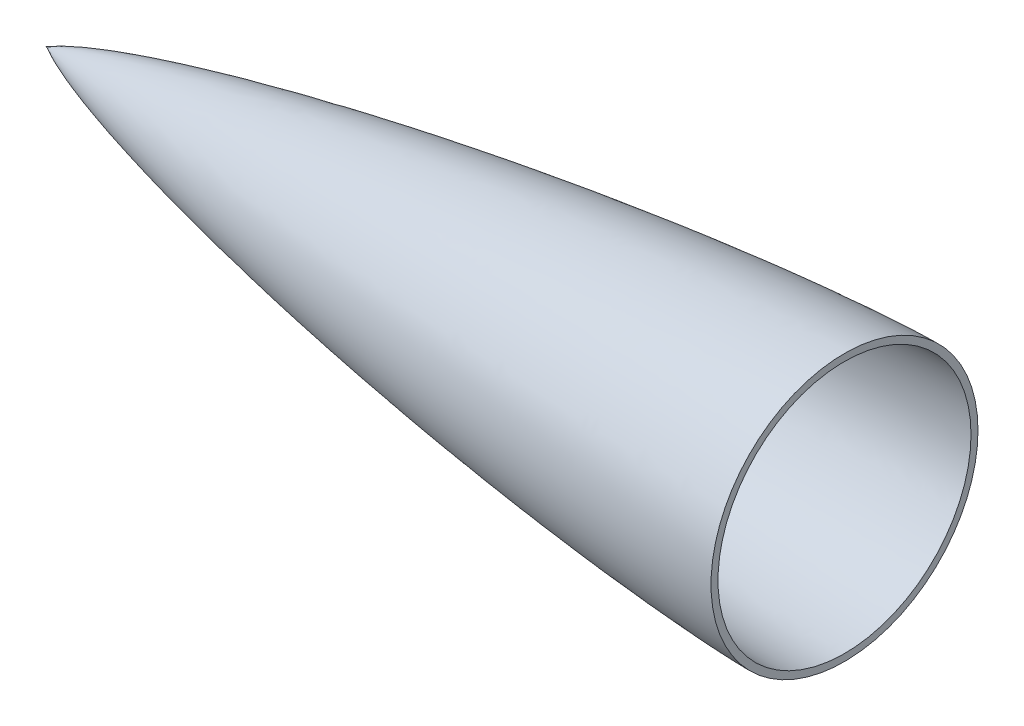
ISO-10303-21;
HEADER;
FILE_DESCRIPTION(('STEP AP214'),'2;1');
FILE_NAME('part.step','',(''),(''),'','','');
FILE_SCHEMA(('AUTOMOTIVE_DESIGN { 1 0 10303 214 1 1 1 1 }'));
ENDSEC;
DATA;
#1=APPLICATION_CONTEXT('core data for automotive mechanical design processes');
#2=APPLICATION_PROTOCOL_DEFINITION('international standard','automotive_design',2000,#1);
#3=PRODUCT_CONTEXT('',#1,'mechanical');
#4=PRODUCT('Part','Part','',(#3));
#5=PRODUCT_RELATED_PRODUCT_CATEGORY('part','',(#4));
#6=PRODUCT_DEFINITION_FORMATION('','',#4);
#7=PRODUCT_DEFINITION_CONTEXT('part definition',#1,'design');
#8=PRODUCT_DEFINITION('design','',#6,#7);
#9=PRODUCT_DEFINITION_SHAPE('','',#8);
#10=(LENGTH_UNIT() NAMED_UNIT(*) SI_UNIT(.MILLI.,.METRE.));
#11=(NAMED_UNIT(*) PLANE_ANGLE_UNIT() SI_UNIT($,.RADIAN.));
#12=(NAMED_UNIT(*) SI_UNIT($,.STERADIAN.) SOLID_ANGLE_UNIT());
#13=UNCERTAINTY_MEASURE_WITH_UNIT(LENGTH_MEASURE(1.E-05),#10,'distance_accuracy_value','');
#14=(GEOMETRIC_REPRESENTATION_CONTEXT(3) GLOBAL_UNCERTAINTY_ASSIGNED_CONTEXT((#13)) GLOBAL_UNIT_ASSIGNED_CONTEXT((#10,
#11,#12)) REPRESENTATION_CONTEXT('',''));
#15=CARTESIAN_POINT('',(0.,0.,0.));
#16=DIRECTION('',(0.,0.,1.));
#17=DIRECTION('',(1.,0.,0.));
#18=AXIS2_PLACEMENT_3D('',#15,#16,#17);
#19=CARTESIAN_POINT('',(200.,0.,-33.4355685150698));
#20=CARTESIAN_POINT('',(199.322179654003,0.,-33.4323383643763));
#21=CARTESIAN_POINT('',(197.96668201448,0.,-33.4109822420062));
#22=CARTESIAN_POINT('',(193.575946740602,0.,-33.2950534490437));
#23=CARTESIAN_POINT('',(186.154623569186,0.,-32.9539645763986));
#24=CARTESIAN_POINT('',(176.386553472775,0.,-32.3323949245245));
#25=CARTESIAN_POINT('',(164.280072944056,0.,-31.3478971261456));
#26=CARTESIAN_POINT('',(152.189147407201,0.,-30.1899129927248));
#27=CARTESIAN_POINT('',(140.114018126728,0.,-28.8775873685312));
#28=CARTESIAN_POINT('',(128.05522623978,0.,-27.4232989862083));
#29=CARTESIAN_POINT('',(116.013631476871,0.,-25.8328412652977));
#30=CARTESIAN_POINT('',(103.990482125065,0.,-24.1085760118513));
#31=CARTESIAN_POINT('',(91.9875106556967,0.,-22.248884905431));
#32=CARTESIAN_POINT('',(80.0071383039936,0.,-20.2486418789882));
#33=CARTESIAN_POINT('',(68.052752748457,0.,-18.0981923642982));
#34=CARTESIAN_POINT('',(56.1293217805533,0.,-15.7818096250316));
#35=CARTESIAN_POINT('',(44.2443671822434,0.,-13.2745922542246));
#36=CARTESIAN_POINT('',(33.2254451342742,0.,-10.7238520935605));
#37=CARTESIAN_POINT('',(23.7399008996518,0.,-8.29191144076045));
#38=CARTESIAN_POINT('',(16.1615279538934,0.,-6.12216645315078));
#39=CARTESIAN_POINT('',(10.7984161562651,0.,-4.41093759935858));
#40=CARTESIAN_POINT('',(7.06503905609062,0.,-3.08569859262728));
#41=CARTESIAN_POINT('',(4.42378862410607,0.,-2.04005703667645));
#42=CARTESIAN_POINT('',(2.70977796726177,0.,-1.28363377804088));
#43=CARTESIAN_POINT('',(1.58549241696781,0.,-0.737587827803518));
#44=CARTESIAN_POINT('',(0.90429535730028,0.,-0.386360833356651));
#45=CARTESIAN_POINT('',(0.549478166428491,0.,-0.203997996855062));
#46=CARTESIAN_POINT('',(0.304588775814575,0.,-0.0914897913141497));
#47=CARTESIAN_POINT('',(0.175151488046642,0.,-0.0408399449586508));
#48=CARTESIAN_POINT('',(0.0889645538634368,0.,-0.0127715996474495));
#49=CARTESIAN_POINT('',(0.0297309525910866,0.,-0.00266548567570939));
#50=CARTESIAN_POINT('',(0.,0.,0.));
#51=B_SPLINE_CURVE_WITH_KNOTS('',4,(#19,#20,#21,#22,#23,#24,#25,#26,#27,#28,#29,#30,#31,#32,#33,
#34,#35,#36,#37,#38,#39,#40,#41,#42,#43,#44,#45,#46,#47,#48,#49,#50),.UNSPECIFIED.,.F.,.F.,(5,1,
1,1,1,1,1,1,1,1,1,1,1,1,1,1,1,1,1,1,1,1,1,1,1,1,1,1,5),(0.,0.0133209642117482,
0.0266419284234964,0.0863167691697009,0.145991610068889,0.205666451663834,0.265341292558525,
0.325016131418618,0.384690973552768,0.444365812322199,0.50404065606741,0.563715493321218,
0.623390332433378,0.683065171883309,0.742740011906119,0.802414855634365,0.862089687624013,
0.905325029529881,0.935162430760937,0.957312634774657,0.972707485547451,0.983165991718057,
0.990977432175115,0.994122067130278,0.997266702085442,0.998227464598054,0.998817984622571,
0.999415053510214,1.),.UNSPECIFIED.);
#52=CARTESIAN_POINT('',(200.,0.,0.));
#53=DIRECTION('',(1.,0.,0.));
#54=AXIS1_PLACEMENT('',#52,#53);
#55=SURFACE_OF_REVOLUTION('',#51,#54);
#56=CARTESIAN_POINT('',(0.,0.,0.));
#57=VERTEX_POINT('',#56);
#58=VERTEX_LOOP('',#57);
#59=FACE_BOUND('',#58,.T.);
#60=CARTESIAN_POINT('',(200.,0.,0.));
#61=DIRECTION('',(1.,0.,0.));
#62=DIRECTION('',(0.,0.,-1.));
#63=AXIS2_PLACEMENT_3D('',#60,#61,#62);
#64=CIRCLE('',#63,33.4355685150698);
#65=CARTESIAN_POINT('',(200.,0.,-33.4355685150698));
#66=VERTEX_POINT('',#65);
#67=EDGE_CURVE('E11',#66,#66,#64,.T.);
#68=ORIENTED_EDGE('',*,*,#67,.F.);
#69=EDGE_LOOP('',(#68));
#70=FACE_BOUND('',#69,.T.);
#71=ADVANCED_FACE('F32',(#59,#70),#55,.F.);
#72=CARTESIAN_POINT('',(200.,0.,-33.4355685150698));
#73=DIRECTION('',(1.,0.,0.));
#74=DIRECTION('',(0.,0.,-1.));
#75=AXIS2_PLACEMENT_3D('',#72,#73,#74);
#76=PLANE('',#75);
#77=CARTESIAN_POINT('',(200.,0.,0.));
#78=DIRECTION('',(1.,0.,0.));
#79=DIRECTION('',(0.,0.,-1.));
#80=AXIS2_PLACEMENT_3D('',#77,#78,#79);
#81=CIRCLE('',#80,31.6855482124485);
#82=CARTESIAN_POINT('',(200.,0.,-31.6855482124485));
#83=VERTEX_POINT('',#82);
#84=EDGE_CURVE('E39',#83,#83,#81,.T.);
#85=ORIENTED_EDGE('',*,*,#84,.F.);
#86=EDGE_LOOP('',(#85));
#87=FACE_BOUND('',#86,.T.);
#88=ORIENTED_EDGE('',*,*,#67,.T.);
#89=EDGE_LOOP('',(#88));
#90=FACE_BOUND('',#89,.T.);
#91=ADVANCED_FACE('F48',(#87,#90),#76,.T.);
#92=CARTESIAN_POINT('',(200.,0.,-33.4355685150698));
#93=CARTESIAN_POINT('',(199.322179654003,0.,-33.4323383643763));
#94=CARTESIAN_POINT('',(197.96668201448,0.,-33.4109822420062));
#95=CARTESIAN_POINT('',(193.575946740602,0.,-33.2950534490437));
#96=CARTESIAN_POINT('',(186.154623569186,0.,-32.9539645763986));
#97=CARTESIAN_POINT('',(176.386553472775,0.,-32.3323949245245));
#98=CARTESIAN_POINT('',(164.280072944056,0.,-31.3478971261456));
#99=CARTESIAN_POINT('',(152.189147407201,0.,-30.1899129927248));
#100=CARTESIAN_POINT('',(140.114018126728,0.,-28.8775873685312));
#101=CARTESIAN_POINT('',(128.05522623978,0.,-27.4232989862083));
#102=CARTESIAN_POINT('',(116.013631476871,0.,-25.8328412652977));
#103=CARTESIAN_POINT('',(103.990482125065,0.,-24.1085760118513));
#104=CARTESIAN_POINT('',(91.9875106556967,0.,-22.248884905431));
#105=CARTESIAN_POINT('',(80.0071383039936,0.,-20.2486418789882));
#106=CARTESIAN_POINT('',(68.052752748457,0.,-18.0981923642982));
#107=CARTESIAN_POINT('',(56.1293217805533,0.,-15.7818096250316));
#108=CARTESIAN_POINT('',(44.2443671822434,0.,-13.2745922542246));
#109=CARTESIAN_POINT('',(33.2254451342742,0.,-10.7238520935605));
#110=CARTESIAN_POINT('',(23.7399008996518,0.,-8.29191144076045));
#111=CARTESIAN_POINT('',(16.1615279538934,0.,-6.12216645315078));
#112=CARTESIAN_POINT('',(10.7984161562651,0.,-4.41093759935858));
#113=CARTESIAN_POINT('',(7.15446609725211,0.,-3.11744256062833));
#114=CARTESIAN_POINT('',(4.96995131345689,0.,-2.25613461671395));
#115=CARTESIAN_POINT('',(3.84672985171564,0.,-1.7780436069638));
#116=CARTESIAN_POINT('',(3.44639537802266,0.,-1.60209691594584));
#117=B_SPLINE_CURVE_WITH_KNOTS('',4,(#92,#93,#94,#95,#96,#97,#98,#99,#100,#101,#102,#103,#104,
#105,#106,#107,#108,#109,#110,#111,#112,#113,#114,#115,#116),.UNSPECIFIED.,.F.,.F.,(5,1,1,1,1,1,
1,1,1,1,1,1,1,1,1,1,1,1,1,1,1,5),(0.,0.0133209642117482,0.0266419284234964,0.0863167691697009,
0.145991610068889,0.205666451663834,0.265341292558525,0.325016131418618,0.384690973552768,
0.444365812322199,0.50404065606741,0.563715493321218,0.623390332433378,0.683065171883309,
0.742740011906119,0.802414855634365,0.862089687624013,0.905325029529881,0.935162430760937,
0.957312634774657,0.972707485547451,0.981301436720565),.UNSPECIFIED.);
#118=CARTESIAN_POINT('',(200.,0.,0.));
#119=DIRECTION('',(1.,0.,0.));
#120=AXIS1_PLACEMENT('',#118,#119);
#121=SURFACE_OF_REVOLUTION('',#117,#120);
#122=OFFSET_SURFACE('',#121,1.75,.F.);
#123=CARTESIAN_POINT('',(4.15051573131235,0.,0.));
#124=VERTEX_POINT('',#123);
#125=VERTEX_LOOP('',#124);
#126=FACE_BOUND('',#125,.T.);
#127=ORIENTED_EDGE('',*,*,#84,.T.);
#128=EDGE_LOOP('',(#127));
#129=FACE_BOUND('',#128,.T.);
#130=ADVANCED_FACE('F45',(#126,#129),#122,.T.);
#131=CLOSED_SHELL('',(#71,#91,#130));
#132=MANIFOLD_SOLID_BREP('B2',#131);
#133=ADVANCED_BREP_SHAPE_REPRESENTATION('',(#18,#132),#14);
#134=SHAPE_DEFINITION_REPRESENTATION(#9,#133);
ENDSEC;
END-ISO-10303-21;
